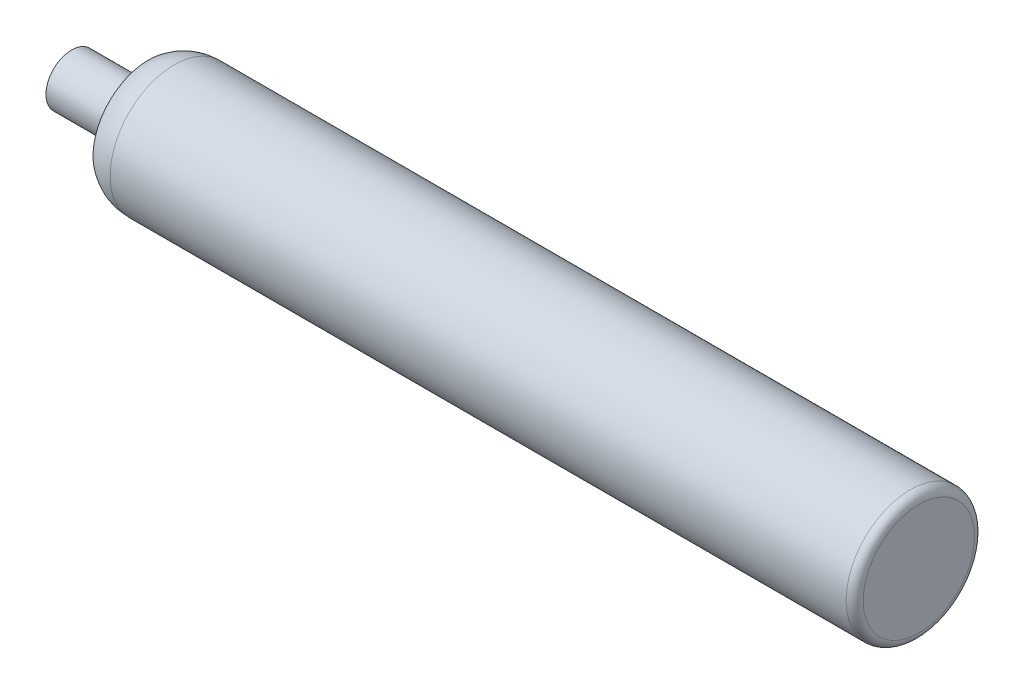
ISO-10303-21;
HEADER;
FILE_DESCRIPTION(('STEP AP214'),'2;1');
FILE_NAME('part.step','',(''),(''),'','','');
FILE_SCHEMA(('AUTOMOTIVE_DESIGN { 1 0 10303 214 1 1 1 1 }'));
ENDSEC;
DATA;
#1=APPLICATION_CONTEXT('core data for automotive mechanical design processes');
#2=APPLICATION_PROTOCOL_DEFINITION('international standard','automotive_design',2000,#1);
#3=PRODUCT_CONTEXT('',#1,'mechanical');
#4=PRODUCT('Part','Part','',(#3));
#5=PRODUCT_RELATED_PRODUCT_CATEGORY('part','',(#4));
#6=PRODUCT_DEFINITION_FORMATION('','',#4);
#7=PRODUCT_DEFINITION_CONTEXT('part definition',#1,'design');
#8=PRODUCT_DEFINITION('design','',#6,#7);
#9=PRODUCT_DEFINITION_SHAPE('','',#8);
#10=(LENGTH_UNIT() NAMED_UNIT(*) SI_UNIT(.MILLI.,.METRE.));
#11=(NAMED_UNIT(*) PLANE_ANGLE_UNIT() SI_UNIT($,.RADIAN.));
#12=(NAMED_UNIT(*) SI_UNIT($,.STERADIAN.) SOLID_ANGLE_UNIT());
#13=UNCERTAINTY_MEASURE_WITH_UNIT(LENGTH_MEASURE(1.E-05),#10,'distance_accuracy_value','');
#14=(GEOMETRIC_REPRESENTATION_CONTEXT(3) GLOBAL_UNCERTAINTY_ASSIGNED_CONTEXT((#13)) GLOBAL_UNIT_ASSIGNED_CONTEXT((#10,
#11,#12)) REPRESENTATION_CONTEXT('',''));
#15=CARTESIAN_POINT('',(0.,0.,0.));
#16=DIRECTION('',(0.,0.,1.));
#17=DIRECTION('',(1.,0.,0.));
#18=AXIS2_PLACEMENT_3D('',#15,#16,#17);
#19=CARTESIAN_POINT('',(99.,0.,0.));
#20=DIRECTION('',(1.,0.,0.));
#21=DIRECTION('',(0.,0.,-1.));
#22=AXIS2_PLACEMENT_3D('',#19,#20,#21);
#23=PLANE('',#22);
#24=CARTESIAN_POINT('',(99.,0.,0.));
#25=DIRECTION('',(1.,0.,0.));
#26=DIRECTION('',(0.,0.,-1.));
#27=AXIS2_PLACEMENT_3D('',#24,#25,#26);
#28=CIRCLE('',#27,6.5);
#29=CARTESIAN_POINT('',(99.,0.,-6.5));
#30=VERTEX_POINT('',#29);
#31=EDGE_CURVE('E10',#30,#30,#28,.T.);
#32=ORIENTED_EDGE('',*,*,#31,.T.);
#33=EDGE_LOOP('',(#32));
#34=FACE_BOUND('',#33,.T.);
#35=ADVANCED_FACE('F35',(#34),#23,.T.);
#36=CARTESIAN_POINT('',(98.,0.,0.));
#37=DIRECTION('',(1.,0.,0.));
#38=DIRECTION('',(0.,0.,-1.));
#39=AXIS2_PLACEMENT_3D('',#36,#37,#38);
#40=TOROIDAL_SURFACE('',#39,6.5,1.);
#41=CARTESIAN_POINT('',(98.,0.,0.));
#42=DIRECTION('',(1.,0.,0.));
#43=DIRECTION('',(0.,0.,-1.));
#44=AXIS2_PLACEMENT_3D('',#41,#42,#43);
#45=CIRCLE('',#44,7.50000000000001);
#46=CARTESIAN_POINT('',(98.,0.,-7.50000000000001));
#47=VERTEX_POINT('',#46);
#48=EDGE_CURVE('E41',#47,#47,#45,.T.);
#49=ORIENTED_EDGE('',*,*,#48,.T.);
#50=EDGE_LOOP('',(#49));
#51=FACE_BOUND('',#50,.T.);
#52=ORIENTED_EDGE('',*,*,#31,.F.);
#53=EDGE_LOOP('',(#52));
#54=FACE_BOUND('',#53,.T.);
#55=ADVANCED_FACE('F73',(#51,#54),#40,.T.);
#56=CARTESIAN_POINT('',(0.,0.,0.));
#57=DIRECTION('',(1.,0.,0.));
#58=DIRECTION('',(0.,0.,-1.));
#59=AXIS2_PLACEMENT_3D('',#56,#57,#58);
#60=CYLINDRICAL_SURFACE('',#59,7.5);
#61=ORIENTED_EDGE('',*,*,#48,.F.);
#62=EDGE_LOOP('',(#61));
#63=FACE_BOUND('',#62,.T.);
#64=CARTESIAN_POINT('',(12.,0.,0.));
#65=DIRECTION('',(1.,0.,0.));
#66=DIRECTION('',(0.,0.,-1.));
#67=AXIS2_PLACEMENT_3D('',#64,#65,#66);
#68=CIRCLE('',#67,7.5);
#69=CARTESIAN_POINT('',(12.,0.,-7.5));
#70=VERTEX_POINT('',#69);
#71=EDGE_CURVE('E45',#70,#70,#68,.T.);
#72=ORIENTED_EDGE('',*,*,#71,.T.);
#73=EDGE_LOOP('',(#72));
#74=FACE_BOUND('',#73,.T.);
#75=ADVANCED_FACE('F77',(#63,#74),#60,.T.);
#76=CARTESIAN_POINT('',(12.,0.,0.));
#77=DIRECTION('',(1.,0.,0.));
#78=DIRECTION('',(0.,0.,-1.));
#79=AXIS2_PLACEMENT_3D('',#76,#77,#78);
#80=DEGENERATE_TOROIDAL_SURFACE('',#79,2.5,5.,.T.);
#81=CARTESIAN_POINT('',(9.,0.,0.));
#82=DIRECTION('',(1.,0.,0.));
#83=DIRECTION('',(0.,0.,-1.));
#84=AXIS2_PLACEMENT_3D('',#81,#82,#83);
#85=CIRCLE('',#84,6.5);
#86=CARTESIAN_POINT('',(9.,0.,-6.5));
#87=VERTEX_POINT('',#86);
#88=EDGE_CURVE('E49',#87,#87,#85,.T.);
#89=ORIENTED_EDGE('',*,*,#88,.T.);
#90=EDGE_LOOP('',(#89));
#91=FACE_BOUND('',#90,.T.);
#92=ORIENTED_EDGE('',*,*,#71,.F.);
#93=EDGE_LOOP('',(#92));
#94=FACE_BOUND('',#93,.T.);
#95=ADVANCED_FACE('F81',(#91,#94),#80,.T.);
#96=CARTESIAN_POINT('',(9.,0.,0.));
#97=DIRECTION('',(1.,0.,0.));
#98=DIRECTION('',(0.,0.,-1.));
#99=AXIS2_PLACEMENT_3D('',#96,#97,#98);
#100=PLANE('',#99);
#101=ORIENTED_EDGE('',*,*,#88,.F.);
#102=EDGE_LOOP('',(#101));
#103=FACE_BOUND('',#102,.T.);
#104=CARTESIAN_POINT('',(9.,0.,0.));
#105=DIRECTION('',(1.,0.,0.));
#106=DIRECTION('',(0.,0.,-1.));
#107=AXIS2_PLACEMENT_3D('',#104,#105,#106);
#108=CIRCLE('',#107,3.);
#109=CARTESIAN_POINT('',(9.,0.,-3.));
#110=VERTEX_POINT('',#109);
#111=EDGE_CURVE('E54',#110,#110,#108,.T.);
#112=ORIENTED_EDGE('',*,*,#111,.T.);
#113=EDGE_LOOP('',(#112));
#114=FACE_BOUND('',#113,.T.);
#115=ADVANCED_FACE('F69',(#103,#114),#100,.F.);
#116=CARTESIAN_POINT('',(0.,0.,0.));
#117=DIRECTION('',(1.,0.,0.));
#118=DIRECTION('',(0.,0.,-1.));
#119=AXIS2_PLACEMENT_3D('',#116,#117,#118);
#120=CYLINDRICAL_SURFACE('',#119,3.);
#121=ORIENTED_EDGE('',*,*,#111,.F.);
#122=EDGE_LOOP('',(#121));
#123=FACE_BOUND('',#122,.T.);
#124=CARTESIAN_POINT('',(0.,0.,0.));
#125=DIRECTION('',(1.,0.,0.));
#126=DIRECTION('',(0.,0.,-1.));
#127=AXIS2_PLACEMENT_3D('',#124,#125,#126);
#128=CIRCLE('',#127,3.);
#129=CARTESIAN_POINT('',(0.,0.,-3.));
#130=VERTEX_POINT('',#129);
#131=EDGE_CURVE('E57',#130,#130,#128,.T.);
#132=ORIENTED_EDGE('',*,*,#131,.T.);
#133=EDGE_LOOP('',(#132));
#134=FACE_BOUND('',#133,.T.);
#135=ADVANCED_FACE('F61',(#123,#134),#120,.T.);
#136=CARTESIAN_POINT('',(0.,0.,0.));
#137=DIRECTION('',(1.,0.,0.));
#138=DIRECTION('',(0.,0.,-1.));
#139=AXIS2_PLACEMENT_3D('',#136,#137,#138);
#140=PLANE('',#139);
#141=ORIENTED_EDGE('',*,*,#131,.F.);
#142=EDGE_LOOP('',(#141));
#143=FACE_BOUND('',#142,.T.);
#144=ADVANCED_FACE('F63',(#143),#140,.F.);
#145=CLOSED_SHELL('',(#35,#55,#75,#95,#115,#135,#144));
#146=MANIFOLD_SOLID_BREP('B2',#145);
#147=ADVANCED_BREP_SHAPE_REPRESENTATION('',(#18,#146),#14);
#148=SHAPE_DEFINITION_REPRESENTATION(#9,#147);
ENDSEC;
END-ISO-10303-21;
